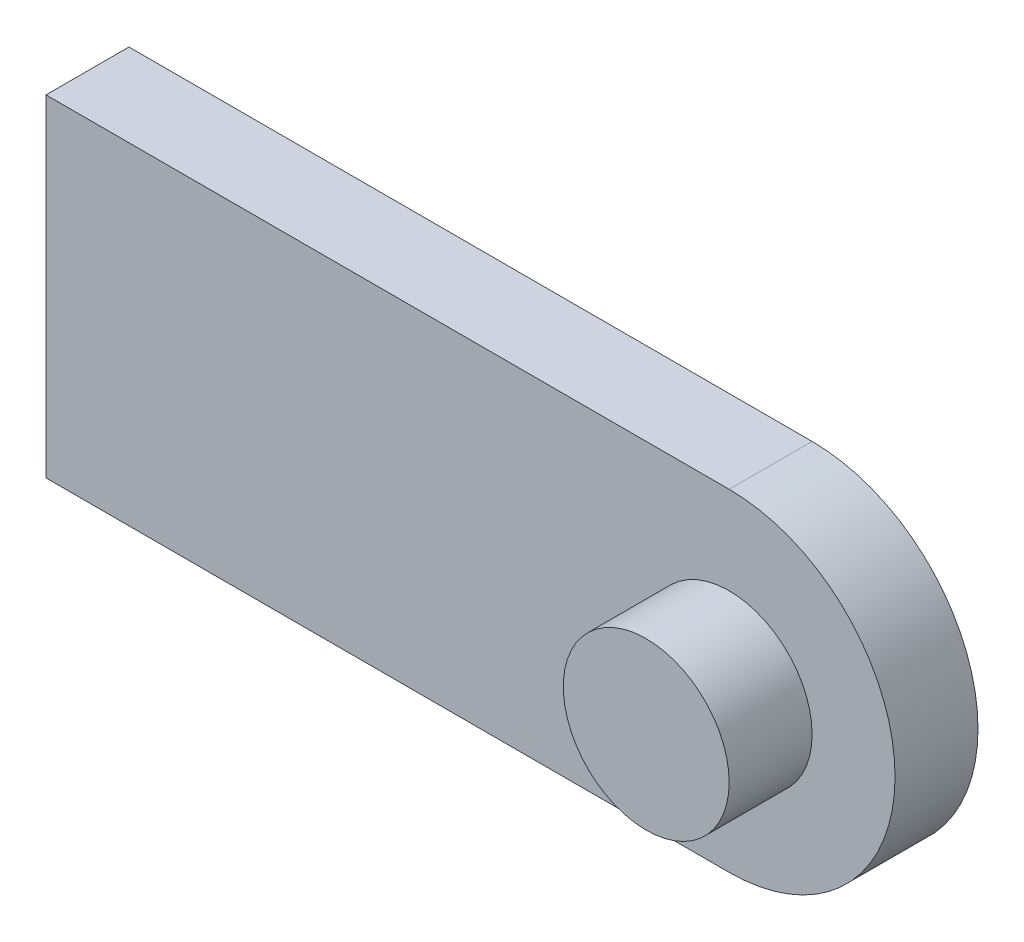
ISO-10303-21;
HEADER;
FILE_DESCRIPTION(('STEP AP214'),'2;1');
FILE_NAME('part.step','',(''),(''),'','','');
FILE_SCHEMA(('AUTOMOTIVE_DESIGN { 1 0 10303 214 1 1 1 1 }'));
ENDSEC;
DATA;
#1=APPLICATION_CONTEXT('core data for automotive mechanical design processes');
#2=APPLICATION_PROTOCOL_DEFINITION('international standard','automotive_design',2000,#1);
#3=PRODUCT_CONTEXT('',#1,'mechanical');
#4=PRODUCT('Part','Part','',(#3));
#5=PRODUCT_RELATED_PRODUCT_CATEGORY('part','',(#4));
#6=PRODUCT_DEFINITION_FORMATION('','',#4);
#7=PRODUCT_DEFINITION_CONTEXT('part definition',#1,'design');
#8=PRODUCT_DEFINITION('design','',#6,#7);
#9=PRODUCT_DEFINITION_SHAPE('','',#8);
#10=(LENGTH_UNIT() NAMED_UNIT(*) SI_UNIT(.MILLI.,.METRE.));
#11=(NAMED_UNIT(*) PLANE_ANGLE_UNIT() SI_UNIT($,.RADIAN.));
#12=(NAMED_UNIT(*) SI_UNIT($,.STERADIAN.) SOLID_ANGLE_UNIT());
#13=UNCERTAINTY_MEASURE_WITH_UNIT(LENGTH_MEASURE(1.E-05),#10,'distance_accuracy_value','');
#14=(GEOMETRIC_REPRESENTATION_CONTEXT(3) GLOBAL_UNCERTAINTY_ASSIGNED_CONTEXT((#13)) GLOBAL_UNIT_ASSIGNED_CONTEXT((#10,
#11,#12)) REPRESENTATION_CONTEXT('',''));
#15=CARTESIAN_POINT('',(0.,0.,0.));
#16=DIRECTION('',(0.,0.,1.));
#17=DIRECTION('',(1.,0.,0.));
#18=AXIS2_PLACEMENT_3D('',#15,#16,#17);
#19=CARTESIAN_POINT('',(0.,0.,10.));
#20=DIRECTION('',(0.,0.,-1.));
#21=DIRECTION('',(-1.,0.,0.));
#22=AXIS2_PLACEMENT_3D('',#19,#20,#21);
#23=CYLINDRICAL_SURFACE('',#22,20.);
#24=CARTESIAN_POINT('',(0.,0.,0.));
#25=DIRECTION('',(0.,0.,1.));
#26=DIRECTION('',(1.,0.,0.));
#27=AXIS2_PLACEMENT_3D('',#24,#25,#26);
#28=CIRCLE('',#27,20.);
#29=CARTESIAN_POINT('',(0.,-20.,0.));
#30=VERTEX_POINT('',#29);
#31=CARTESIAN_POINT('',(0.,20.,0.));
#32=VERTEX_POINT('',#31);
#33=EDGE_CURVE('E96',#30,#32,#28,.T.);
#34=ORIENTED_EDGE('',*,*,#33,.T.);
#35=DIRECTION('',(0.,0.,-1.));
#36=VECTOR('',#35,1.);
#37=CARTESIAN_POINT('',(0.,20.,10.));
#38=LINE('',#37,#36);
#39=CARTESIAN_POINT('',(0.,20.,10.));
#40=VERTEX_POINT('',#39);
#41=EDGE_CURVE('E11',#40,#32,#38,.T.);
#42=ORIENTED_EDGE('',*,*,#41,.F.);
#43=CARTESIAN_POINT('',(0.,0.,10.));
#44=DIRECTION('',(0.,0.,1.));
#45=DIRECTION('',(1.,0.,0.));
#46=AXIS2_PLACEMENT_3D('',#43,#44,#45);
#47=CIRCLE('',#46,20.);
#48=CARTESIAN_POINT('',(0.,-20.,10.));
#49=VERTEX_POINT('',#48);
#50=EDGE_CURVE('E84',#49,#40,#47,.T.);
#51=ORIENTED_EDGE('',*,*,#50,.F.);
#52=DIRECTION('',(0.,0.,-1.));
#53=VECTOR('',#52,1.);
#54=CARTESIAN_POINT('',(0.,-20.,10.));
#55=LINE('',#54,#53);
#56=EDGE_CURVE('E92',#49,#30,#55,.T.);
#57=ORIENTED_EDGE('',*,*,#56,.T.);
#58=EDGE_LOOP('',(#34,#42,#51,#57));
#59=FACE_BOUND('',#58,.T.);
#60=ADVANCED_FACE('F33',(#59),#23,.T.);
#61=CARTESIAN_POINT('',(0.,20.,10.));
#62=DIRECTION('',(0.,-1.,0.));
#63=DIRECTION('',(0.,0.,-1.));
#64=AXIS2_PLACEMENT_3D('',#61,#62,#63);
#65=PLANE('',#64);
#66=DIRECTION('',(-1.,0.,0.));
#67=VECTOR('',#66,1.);
#68=CARTESIAN_POINT('',(0.,20.,0.));
#69=LINE('',#68,#67);
#70=CARTESIAN_POINT('',(-82.3638774735504,20.,0.));
#71=VERTEX_POINT('',#70);
#72=EDGE_CURVE('E88',#32,#71,#69,.T.);
#73=ORIENTED_EDGE('',*,*,#72,.T.);
#74=DIRECTION('',(0.,0.,-1.));
#75=VECTOR('',#74,1.);
#76=CARTESIAN_POINT('',(-82.3638774735504,20.,10.));
#77=LINE('',#76,#75);
#78=CARTESIAN_POINT('',(-82.3638774735504,20.,10.));
#79=VERTEX_POINT('',#78);
#80=EDGE_CURVE('E41',#79,#71,#77,.T.);
#81=ORIENTED_EDGE('',*,*,#80,.F.);
#82=DIRECTION('',(-1.,0.,0.));
#83=VECTOR('',#82,1.);
#84=CARTESIAN_POINT('',(0.,20.,10.));
#85=LINE('',#84,#83);
#86=EDGE_CURVE('E79',#40,#79,#85,.T.);
#87=ORIENTED_EDGE('',*,*,#86,.F.);
#88=ORIENTED_EDGE('',*,*,#41,.T.);
#89=EDGE_LOOP('',(#73,#81,#87,#88));
#90=FACE_BOUND('',#89,.T.);
#91=ADVANCED_FACE('F87',(#90),#65,.F.);
#92=CARTESIAN_POINT('',(-82.3638774735504,20.,10.));
#93=DIRECTION('',(1.,0.,0.));
#94=DIRECTION('',(0.,0.,-1.));
#95=AXIS2_PLACEMENT_3D('',#92,#93,#94);
#96=PLANE('',#95);
#97=DIRECTION('',(0.,-1.,0.));
#98=VECTOR('',#97,1.);
#99=CARTESIAN_POINT('',(-82.3638774735504,20.,0.));
#100=LINE('',#99,#98);
#101=CARTESIAN_POINT('',(-82.3638774735504,-20.,0.));
#102=VERTEX_POINT('',#101);
#103=EDGE_CURVE('E66',#71,#102,#100,.T.);
#104=ORIENTED_EDGE('',*,*,#103,.T.);
#105=DIRECTION('',(0.,0.,-1.));
#106=VECTOR('',#105,1.);
#107=CARTESIAN_POINT('',(-82.3638774735504,-20.,10.));
#108=LINE('',#107,#106);
#109=CARTESIAN_POINT('',(-82.3638774735504,-20.,10.));
#110=VERTEX_POINT('',#109);
#111=EDGE_CURVE('E89',#110,#102,#108,.T.);
#112=ORIENTED_EDGE('',*,*,#111,.F.);
#113=DIRECTION('',(0.,-1.,0.));
#114=VECTOR('',#113,1.);
#115=CARTESIAN_POINT('',(-82.3638774735504,20.,10.));
#116=LINE('',#115,#114);
#117=EDGE_CURVE('E82',#79,#110,#116,.T.);
#118=ORIENTED_EDGE('',*,*,#117,.F.);
#119=ORIENTED_EDGE('',*,*,#80,.T.);
#120=EDGE_LOOP('',(#104,#112,#118,#119));
#121=FACE_BOUND('',#120,.T.);
#122=ADVANCED_FACE('F90',(#121),#96,.F.);
#123=CARTESIAN_POINT('',(0.,-20.,10.));
#124=DIRECTION('',(0.,1.,0.));
#125=DIRECTION('',(0.,0.,1.));
#126=AXIS2_PLACEMENT_3D('',#123,#124,#125);
#127=PLANE('',#126);
#128=DIRECTION('',(1.,0.,0.));
#129=VECTOR('',#128,1.);
#130=CARTESIAN_POINT('',(0.,-20.,0.));
#131=LINE('',#130,#129);
#132=EDGE_CURVE('E72',#102,#30,#131,.T.);
#133=ORIENTED_EDGE('',*,*,#132,.T.);
#134=ORIENTED_EDGE('',*,*,#56,.F.);
#135=DIRECTION('',(1.,0.,0.));
#136=VECTOR('',#135,1.);
#137=CARTESIAN_POINT('',(0.,-20.,10.));
#138=LINE('',#137,#136);
#139=EDGE_CURVE('E49',#110,#49,#138,.T.);
#140=ORIENTED_EDGE('',*,*,#139,.F.);
#141=ORIENTED_EDGE('',*,*,#111,.T.);
#142=EDGE_LOOP('',(#133,#134,#140,#141));
#143=FACE_BOUND('',#142,.T.);
#144=ADVANCED_FACE('F104',(#143),#127,.F.);
#145=CARTESIAN_POINT('',(0.,0.,10.));
#146=DIRECTION('',(0.,0.,1.));
#147=DIRECTION('',(1.,0.,0.));
#148=AXIS2_PLACEMENT_3D('',#145,#146,#147);
#149=PLANE('',#148);
#150=CARTESIAN_POINT('',(0.,-0.593223752332506,10.));
#151=DIRECTION('',(0.,0.,1.));
#152=DIRECTION('',(1.,0.,0.));
#153=AXIS2_PLACEMENT_3D('',#150,#151,#152);
#154=CIRCLE('',#153,10.);
#155=CARTESIAN_POINT('',(10.,-0.593223752332506,10.));
#156=VERTEX_POINT('',#155);
#157=EDGE_CURVE('E110',#156,#156,#154,.T.);
#158=ORIENTED_EDGE('',*,*,#157,.F.);
#159=EDGE_LOOP('',(#158));
#160=FACE_BOUND('',#159,.T.);
#161=ORIENTED_EDGE('',*,*,#50,.T.);
#162=ORIENTED_EDGE('',*,*,#86,.T.);
#163=ORIENTED_EDGE('',*,*,#117,.T.);
#164=ORIENTED_EDGE('',*,*,#139,.T.);
#165=EDGE_LOOP('',(#161,#162,#163,#164));
#166=FACE_BOUND('',#165,.T.);
#167=ADVANCED_FACE('F80',(#160,#166),#149,.T.);
#168=CARTESIAN_POINT('',(0.,0.,0.));
#169=DIRECTION('',(0.,0.,1.));
#170=DIRECTION('',(1.,0.,0.));
#171=AXIS2_PLACEMENT_3D('',#168,#169,#170);
#172=PLANE('',#171);
#173=ORIENTED_EDGE('',*,*,#33,.F.);
#174=ORIENTED_EDGE('',*,*,#132,.F.);
#175=ORIENTED_EDGE('',*,*,#103,.F.);
#176=ORIENTED_EDGE('',*,*,#72,.F.);
#177=EDGE_LOOP('',(#173,#174,#175,#176));
#178=FACE_BOUND('',#177,.T.);
#179=ADVANCED_FACE('F107',(#178),#172,.F.);
#180=CARTESIAN_POINT('',(0.,-0.593223752332506,20.));
#181=DIRECTION('',(0.,0.,-1.));
#182=DIRECTION('',(-1.,0.,0.));
#183=AXIS2_PLACEMENT_3D('',#180,#181,#182);
#184=CYLINDRICAL_SURFACE('',#183,10.);
#185=CARTESIAN_POINT('',(0.,-0.593223752332506,20.));
#186=DIRECTION('',(0.,0.,1.));
#187=DIRECTION('',(1.,0.,0.));
#188=AXIS2_PLACEMENT_3D('',#185,#186,#187);
#189=CIRCLE('',#188,10.);
#190=CARTESIAN_POINT('',(10.,-0.593223752332506,20.));
#191=VERTEX_POINT('',#190);
#192=EDGE_CURVE('E99',#191,#191,#189,.T.);
#193=ORIENTED_EDGE('',*,*,#192,.F.);
#194=EDGE_LOOP('',(#193));
#195=FACE_BOUND('',#194,.T.);
#196=ORIENTED_EDGE('',*,*,#157,.T.);
#197=EDGE_LOOP('',(#196));
#198=FACE_BOUND('',#197,.T.);
#199=ADVANCED_FACE('F118',(#195,#198),#184,.T.);
#200=CARTESIAN_POINT('',(0.,-0.593223752332506,20.));
#201=DIRECTION('',(0.,0.,1.));
#202=DIRECTION('',(1.,0.,0.));
#203=AXIS2_PLACEMENT_3D('',#200,#201,#202);
#204=PLANE('',#203);
#205=ORIENTED_EDGE('',*,*,#192,.T.);
#206=EDGE_LOOP('',(#205));
#207=FACE_BOUND('',#206,.T.);
#208=ADVANCED_FACE('F116',(#207),#204,.T.);
#209=CLOSED_SHELL('',(#60,#91,#122,#144,#167,#179,#199,#208));
#210=MANIFOLD_SOLID_BREP('B2',#209);
#211=ADVANCED_BREP_SHAPE_REPRESENTATION('',(#18,#210),#14);
#212=SHAPE_DEFINITION_REPRESENTATION(#9,#211);
ENDSEC;
END-ISO-10303-21;
